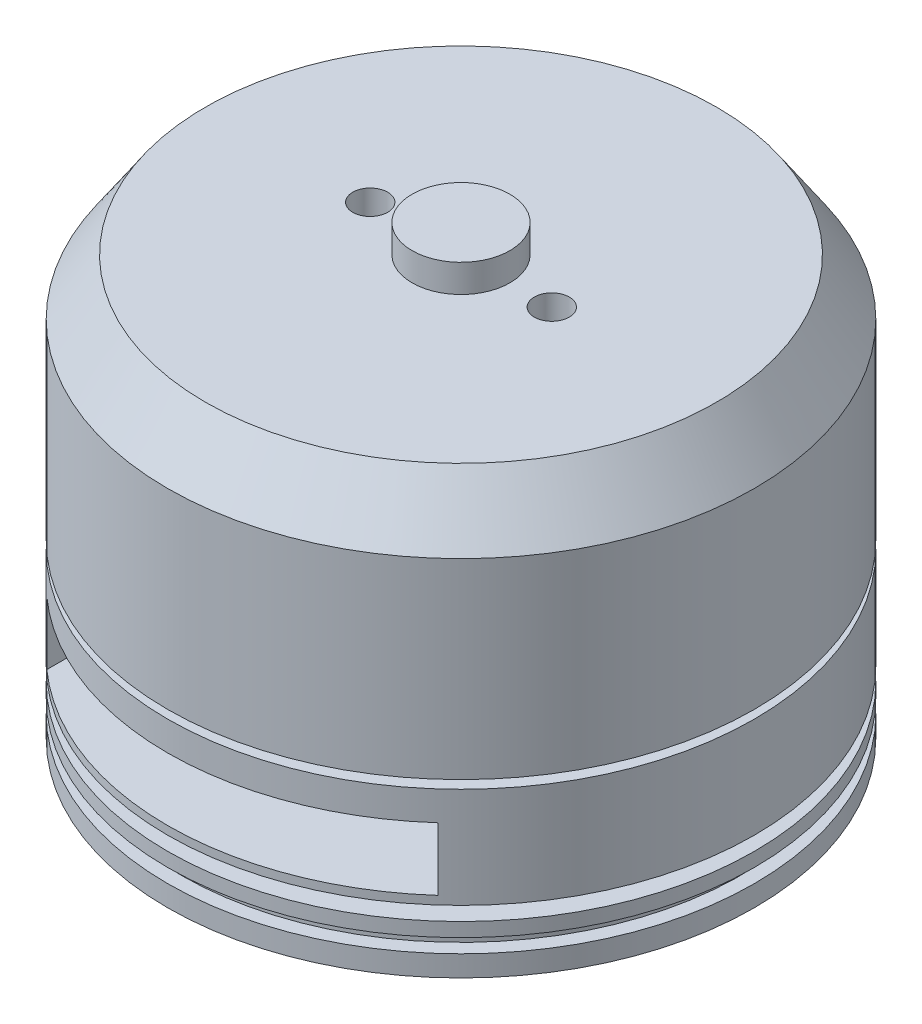
ISO-10303-21;
HEADER;
FILE_DESCRIPTION(('STEP AP214'),'2;1');
FILE_NAME('part.step','',(''),(''),'','','');
FILE_SCHEMA(('AUTOMOTIVE_DESIGN { 1 0 10303 214 1 1 1 1 }'));
ENDSEC;
DATA;
#1=APPLICATION_CONTEXT('core data for automotive mechanical design processes');
#2=APPLICATION_PROTOCOL_DEFINITION('international standard','automotive_design',2000,#1);
#3=PRODUCT_CONTEXT('',#1,'mechanical');
#4=PRODUCT('Part','Part','',(#3));
#5=PRODUCT_RELATED_PRODUCT_CATEGORY('part','',(#4));
#6=PRODUCT_DEFINITION_FORMATION('','',#4);
#7=PRODUCT_DEFINITION_CONTEXT('part definition',#1,'design');
#8=PRODUCT_DEFINITION('design','',#6,#7);
#9=PRODUCT_DEFINITION_SHAPE('','',#8);
#10=(LENGTH_UNIT() NAMED_UNIT(*) SI_UNIT(.MILLI.,.METRE.));
#11=(NAMED_UNIT(*) PLANE_ANGLE_UNIT() SI_UNIT($,.RADIAN.));
#12=(NAMED_UNIT(*) SI_UNIT($,.STERADIAN.) SOLID_ANGLE_UNIT());
#13=UNCERTAINTY_MEASURE_WITH_UNIT(LENGTH_MEASURE(1.E-05),#10,'distance_accuracy_value','');
#14=(GEOMETRIC_REPRESENTATION_CONTEXT(3) GLOBAL_UNCERTAINTY_ASSIGNED_CONTEXT((#13)) GLOBAL_UNIT_ASSIGNED_CONTEXT((#10,
#11,#12)) REPRESENTATION_CONTEXT('',''));
#15=CARTESIAN_POINT('',(0.,0.,0.));
#16=DIRECTION('',(0.,0.,1.));
#17=DIRECTION('',(1.,0.,0.));
#18=AXIS2_PLACEMENT_3D('',#15,#16,#17);
#19=CARTESIAN_POINT('',(0.,43.7,0.));
#20=DIRECTION('',(0.,1.,0.));
#21=DIRECTION('',(0.,0.,1.));
#22=AXIS2_PLACEMENT_3D('',#19,#20,#21);
#23=CYLINDRICAL_SURFACE('',#22,3.5);
#24=CARTESIAN_POINT('',(0.,38.7,0.));
#25=DIRECTION('',(0.,1.,0.));
#26=DIRECTION('',(0.,0.,1.));
#27=AXIS2_PLACEMENT_3D('',#24,#25,#26);
#28=CIRCLE('',#27,3.5);
#29=CARTESIAN_POINT('',(0.,38.7,3.5));
#30=VERTEX_POINT('',#29);
#31=EDGE_CURVE('E119',#30,#30,#28,.T.);
#32=ORIENTED_EDGE('',*,*,#31,.T.);
#33=EDGE_LOOP('',(#32));
#34=FACE_BOUND('',#33,.T.);
#35=CARTESIAN_POINT('',(0.,40.7,0.));
#36=DIRECTION('',(0.,1.,0.));
#37=DIRECTION('',(0.,0.,1.));
#38=AXIS2_PLACEMENT_3D('',#35,#36,#37);
#39=CIRCLE('',#38,3.5);
#40=CARTESIAN_POINT('',(0.,40.7,3.5));
#41=VERTEX_POINT('',#40);
#42=EDGE_CURVE('E98',#41,#41,#39,.T.);
#43=ORIENTED_EDGE('',*,*,#42,.F.);
#44=EDGE_LOOP('',(#43));
#45=FACE_BOUND('',#44,.T.);
#46=ADVANCED_FACE('F36',(#34,#45),#23,.T.);
#47=CARTESIAN_POINT('',(4.1,6.7,0.));
#48=DIRECTION('',(0.,1.,0.));
#49=DIRECTION('',(0.,0.,1.));
#50=AXIS2_PLACEMENT_3D('',#47,#48,#49);
#51=PLANE('',#50);
#52=CARTESIAN_POINT('',(0.,6.7,0.));
#53=DIRECTION('',(0.,1.,0.));
#54=DIRECTION('',(0.,0.,1.));
#55=AXIS2_PLACEMENT_3D('',#52,#53,#54);
#56=CIRCLE('',#55,13.4);
#57=CARTESIAN_POINT('',(0.,6.7,13.4));
#58=VERTEX_POINT('',#57);
#59=EDGE_CURVE('E176',#58,#58,#56,.T.);
#60=ORIENTED_EDGE('',*,*,#59,.F.);
#61=EDGE_LOOP('',(#60));
#62=FACE_BOUND('',#61,.T.);
#63=ADVANCED_FACE('F38',(#62),#51,.F.);
#64=CARTESIAN_POINT('',(0.,43.7,0.));
#65=DIRECTION('',(0.,1.,0.));
#66=DIRECTION('',(0.,0.,1.));
#67=AXIS2_PLACEMENT_3D('',#64,#65,#66);
#68=CYLINDRICAL_SURFACE('',#67,13.4);
#69=CARTESIAN_POINT('',(0.,8.7,0.));
#70=DIRECTION('',(0.,1.,0.));
#71=DIRECTION('',(0.,0.,1.));
#72=AXIS2_PLACEMENT_3D('',#69,#70,#71);
#73=CIRCLE('',#72,13.4);
#74=CARTESIAN_POINT('',(0.,8.7,13.4));
#75=VERTEX_POINT('',#74);
#76=EDGE_CURVE('E173',#75,#75,#73,.T.);
#77=ORIENTED_EDGE('',*,*,#76,.F.);
#78=EDGE_LOOP('',(#77));
#79=FACE_BOUND('',#78,.T.);
#80=ORIENTED_EDGE('',*,*,#59,.T.);
#81=EDGE_LOOP('',(#80));
#82=FACE_BOUND('',#81,.T.);
#83=ADVANCED_FACE('F211',(#79,#82),#68,.T.);
#84=CARTESIAN_POINT('',(13.4,8.7,0.));
#85=DIRECTION('',(0.,1.,0.));
#86=DIRECTION('',(0.,0.,1.));
#87=AXIS2_PLACEMENT_3D('',#84,#85,#86);
#88=PLANE('',#87);
#89=CARTESIAN_POINT('',(0.,8.7,0.));
#90=DIRECTION('',(0.,1.,0.));
#91=DIRECTION('',(0.,0.,1.));
#92=AXIS2_PLACEMENT_3D('',#89,#90,#91);
#93=CIRCLE('',#92,21.);
#94=CARTESIAN_POINT('',(0.,8.7,21.));
#95=VERTEX_POINT('',#94);
#96=EDGE_CURVE('E170',#95,#95,#93,.T.);
#97=ORIENTED_EDGE('',*,*,#96,.F.);
#98=EDGE_LOOP('',(#97));
#99=FACE_BOUND('',#98,.T.);
#100=ORIENTED_EDGE('',*,*,#76,.T.);
#101=EDGE_LOOP('',(#100));
#102=FACE_BOUND('',#101,.T.);
#103=ADVANCED_FACE('F273',(#99,#102),#88,.F.);
#104=CARTESIAN_POINT('',(0.,43.7,0.));
#105=DIRECTION('',(0.,1.,0.));
#106=DIRECTION('',(0.,0.,1.));
#107=AXIS2_PLACEMENT_3D('',#104,#105,#106);
#108=CYLINDRICAL_SURFACE('',#107,21.);
#109=CARTESIAN_POINT('',(0.,10.2,0.));
#110=DIRECTION('',(0.,1.,0.));
#111=DIRECTION('',(0.,0.,1.));
#112=AXIS2_PLACEMENT_3D('',#109,#110,#111);
#113=CIRCLE('',#112,21.);
#114=CARTESIAN_POINT('',(0.,10.2,21.));
#115=VERTEX_POINT('',#114);
#116=EDGE_CURVE('E167',#115,#115,#113,.T.);
#117=ORIENTED_EDGE('',*,*,#116,.F.);
#118=EDGE_LOOP('',(#117));
#119=FACE_BOUND('',#118,.T.);
#120=ORIENTED_EDGE('',*,*,#96,.T.);
#121=EDGE_LOOP('',(#120));
#122=FACE_BOUND('',#121,.T.);
#123=ADVANCED_FACE('F269',(#119,#122),#108,.T.);
#124=CARTESIAN_POINT('',(21.,10.2,0.));
#125=DIRECTION('',(0.,-1.,0.));
#126=DIRECTION('',(0.,0.,-1.));
#127=AXIS2_PLACEMENT_3D('',#124,#125,#126);
#128=PLANE('',#127);
#129=CARTESIAN_POINT('',(0.,10.2,0.));
#130=DIRECTION('',(0.,1.,0.));
#131=DIRECTION('',(0.,0.,1.));
#132=AXIS2_PLACEMENT_3D('',#129,#130,#131);
#133=CIRCLE('',#132,20.);
#134=CARTESIAN_POINT('',(0.,10.2,20.));
#135=VERTEX_POINT('',#134);
#136=EDGE_CURVE('E164',#135,#135,#133,.T.);
#137=ORIENTED_EDGE('',*,*,#136,.F.);
#138=EDGE_LOOP('',(#137));
#139=FACE_BOUND('',#138,.T.);
#140=ORIENTED_EDGE('',*,*,#116,.T.);
#141=EDGE_LOOP('',(#140));
#142=FACE_BOUND('',#141,.T.);
#143=ADVANCED_FACE('F265',(#139,#142),#128,.F.);
#144=CARTESIAN_POINT('',(0.,43.7,0.));
#145=DIRECTION('',(0.,1.,0.));
#146=DIRECTION('',(0.,0.,1.));
#147=AXIS2_PLACEMENT_3D('',#144,#145,#146);
#148=CYLINDRICAL_SURFACE('',#147,20.);
#149=CARTESIAN_POINT('',(0.,11.2,0.));
#150=DIRECTION('',(0.,1.,0.));
#151=DIRECTION('',(0.,0.,1.));
#152=AXIS2_PLACEMENT_3D('',#149,#150,#151);
#153=CIRCLE('',#152,20.);
#154=CARTESIAN_POINT('',(0.,11.2,20.));
#155=VERTEX_POINT('',#154);
#156=EDGE_CURVE('E161',#155,#155,#153,.T.);
#157=ORIENTED_EDGE('',*,*,#156,.F.);
#158=EDGE_LOOP('',(#157));
#159=FACE_BOUND('',#158,.T.);
#160=ORIENTED_EDGE('',*,*,#136,.T.);
#161=EDGE_LOOP('',(#160));
#162=FACE_BOUND('',#161,.T.);
#163=ADVANCED_FACE('F261',(#159,#162),#148,.T.);
#164=CARTESIAN_POINT('',(20.,11.2,0.));
#165=DIRECTION('',(0.,1.,0.));
#166=DIRECTION('',(0.,0.,1.));
#167=AXIS2_PLACEMENT_3D('',#164,#165,#166);
#168=PLANE('',#167);
#169=CARTESIAN_POINT('',(0.,11.2,0.));
#170=DIRECTION('',(0.,1.,0.));
#171=DIRECTION('',(0.,0.,1.));
#172=AXIS2_PLACEMENT_3D('',#169,#170,#171);
#173=CIRCLE('',#172,21.);
#174=CARTESIAN_POINT('',(0.,11.2,21.));
#175=VERTEX_POINT('',#174);
#176=EDGE_CURVE('E158',#175,#175,#173,.T.);
#177=ORIENTED_EDGE('',*,*,#176,.F.);
#178=EDGE_LOOP('',(#177));
#179=FACE_BOUND('',#178,.T.);
#180=ORIENTED_EDGE('',*,*,#156,.T.);
#181=EDGE_LOOP('',(#180));
#182=FACE_BOUND('',#181,.T.);
#183=ADVANCED_FACE('F257',(#179,#182),#168,.F.);
#184=CARTESIAN_POINT('',(0.,43.7,0.));
#185=DIRECTION('',(0.,1.,0.));
#186=DIRECTION('',(0.,0.,1.));
#187=AXIS2_PLACEMENT_3D('',#184,#185,#186);
#188=CYLINDRICAL_SURFACE('',#187,21.);
#189=CARTESIAN_POINT('',(0.,12.2,0.));
#190=DIRECTION('',(0.,1.,0.));
#191=DIRECTION('',(0.,0.,1.));
#192=AXIS2_PLACEMENT_3D('',#189,#190,#191);
#193=CIRCLE('',#192,21.);
#194=CARTESIAN_POINT('',(0.,12.2,21.));
#195=VERTEX_POINT('',#194);
#196=EDGE_CURVE('E155',#195,#195,#193,.T.);
#197=ORIENTED_EDGE('',*,*,#196,.F.);
#198=EDGE_LOOP('',(#197));
#199=FACE_BOUND('',#198,.T.);
#200=ORIENTED_EDGE('',*,*,#176,.T.);
#201=EDGE_LOOP('',(#200));
#202=FACE_BOUND('',#201,.T.);
#203=ADVANCED_FACE('F253',(#199,#202),#188,.T.);
#204=CARTESIAN_POINT('',(21.,12.2,0.));
#205=DIRECTION('',(0.,-1.,0.));
#206=DIRECTION('',(0.,0.,-1.));
#207=AXIS2_PLACEMENT_3D('',#204,#205,#206);
#208=PLANE('',#207);
#209=CARTESIAN_POINT('',(0.,12.2,0.));
#210=DIRECTION('',(0.,1.,0.));
#211=DIRECTION('',(0.,0.,1.));
#212=AXIS2_PLACEMENT_3D('',#209,#210,#211);
#213=CIRCLE('',#212,10.);
#214=CARTESIAN_POINT('',(0.,12.2,10.));
#215=VERTEX_POINT('',#214);
#216=EDGE_CURVE('E152',#215,#215,#213,.T.);
#217=ORIENTED_EDGE('',*,*,#216,.F.);
#218=EDGE_LOOP('',(#217));
#219=FACE_BOUND('',#218,.T.);
#220=ORIENTED_EDGE('',*,*,#196,.T.);
#221=EDGE_LOOP('',(#220));
#222=FACE_BOUND('',#221,.T.);
#223=ADVANCED_FACE('F249',(#219,#222),#208,.F.);
#224=CARTESIAN_POINT('',(0.,43.7,0.));
#225=DIRECTION('',(0.,1.,0.));
#226=DIRECTION('',(0.,0.,1.));
#227=AXIS2_PLACEMENT_3D('',#224,#225,#226);
#228=CYLINDRICAL_SURFACE('',#227,10.);
#229=CARTESIAN_POINT('',(0.,13.2,0.));
#230=DIRECTION('',(0.,1.,0.));
#231=DIRECTION('',(0.,0.,1.));
#232=AXIS2_PLACEMENT_3D('',#229,#230,#231);
#233=CIRCLE('',#232,10.);
#234=CARTESIAN_POINT('',(0.,13.2,10.));
#235=VERTEX_POINT('',#234);
#236=EDGE_CURVE('E149',#235,#235,#233,.T.);
#237=ORIENTED_EDGE('',*,*,#236,.F.);
#238=EDGE_LOOP('',(#237));
#239=FACE_BOUND('',#238,.T.);
#240=ORIENTED_EDGE('',*,*,#216,.T.);
#241=EDGE_LOOP('',(#240));
#242=FACE_BOUND('',#241,.T.);
#243=ADVANCED_FACE('F245',(#239,#242),#228,.T.);
#244=CARTESIAN_POINT('',(10.,13.2,0.));
#245=DIRECTION('',(0.,1.,0.));
#246=DIRECTION('',(0.,0.,1.));
#247=AXIS2_PLACEMENT_3D('',#244,#245,#246);
#248=PLANE('',#247);
#249=CARTESIAN_POINT('',(0.,13.2,0.));
#250=DIRECTION('',(0.,1.,0.));
#251=DIRECTION('',(0.,0.,1.));
#252=AXIS2_PLACEMENT_3D('',#249,#250,#251);
#253=CIRCLE('',#252,21.);
#254=CARTESIAN_POINT('',(0.,13.2,21.));
#255=VERTEX_POINT('',#254);
#256=EDGE_CURVE('E146',#255,#255,#253,.T.);
#257=ORIENTED_EDGE('',*,*,#256,.F.);
#258=EDGE_LOOP('',(#257));
#259=FACE_BOUND('',#258,.T.);
#260=ORIENTED_EDGE('',*,*,#236,.T.);
#261=EDGE_LOOP('',(#260));
#262=FACE_BOUND('',#261,.T.);
#263=ADVANCED_FACE('F242',(#259,#262),#248,.F.);
#264=CARTESIAN_POINT('',(0.,43.7,0.));
#265=DIRECTION('',(0.,1.,0.));
#266=DIRECTION('',(0.,0.,1.));
#267=AXIS2_PLACEMENT_3D('',#264,#265,#266);
#268=CYLINDRICAL_SURFACE('',#267,21.);
#269=CARTESIAN_POINT('',(0.,18.3,0.));
#270=DIRECTION('',(0.,1.,0.));
#271=DIRECTION('',(0.,0.,1.));
#272=AXIS2_PLACEMENT_3D('',#269,#270,#271);
#273=CIRCLE('',#272,21.);
#274=CARTESIAN_POINT('',(-14.,18.3,15.6524758424985));
#275=VERTEX_POINT('',#274);
#276=CARTESIAN_POINT('',(14.,18.3,15.6524758424985));
#277=VERTEX_POINT('',#276);
#278=EDGE_CURVE('E179',#275,#277,#273,.T.);
#279=ORIENTED_EDGE('',*,*,#278,.T.);
#280=DIRECTION('',(0.,1.,0.));
#281=VECTOR('',#280,1.);
#282=CARTESIAN_POINT('',(14.,43.7,15.6524758424985));
#283=LINE('',#282,#281);
#284=CARTESIAN_POINT('',(14.,13.8,15.6524758424985));
#285=VERTEX_POINT('',#284);
#286=EDGE_CURVE('E11',#277,#285,#283,.F.);
#287=ORIENTED_EDGE('',*,*,#286,.T.);
#288=CARTESIAN_POINT('',(0.,13.8,0.));
#289=DIRECTION('',(0.,-1.,0.));
#290=DIRECTION('',(0.,0.,-1.));
#291=AXIS2_PLACEMENT_3D('',#288,#289,#290);
#292=CIRCLE('',#291,21.);
#293=CARTESIAN_POINT('',(-14.,13.8,15.6524758424985));
#294=VERTEX_POINT('',#293);
#295=EDGE_CURVE('E44',#285,#294,#292,.T.);
#296=ORIENTED_EDGE('',*,*,#295,.T.);
#297=DIRECTION('',(0.,1.,0.));
#298=VECTOR('',#297,1.);
#299=CARTESIAN_POINT('',(-14.,43.7,15.6524758424985));
#300=LINE('',#299,#298);
#301=EDGE_CURVE('E58',#294,#275,#300,.T.);
#302=ORIENTED_EDGE('',*,*,#301,.T.);
#303=EDGE_LOOP('',(#279,#287,#296,#302));
#304=FACE_BOUND('',#303,.T.);
#305=CARTESIAN_POINT('',(0.,20.4,0.));
#306=DIRECTION('',(0.,1.,0.));
#307=DIRECTION('',(0.,0.,1.));
#308=AXIS2_PLACEMENT_3D('',#305,#306,#307);
#309=CIRCLE('',#308,21.);
#310=CARTESIAN_POINT('',(0.,20.4,21.));
#311=VERTEX_POINT('',#310);
#312=EDGE_CURVE('E143',#311,#311,#309,.T.);
#313=ORIENTED_EDGE('',*,*,#312,.F.);
#314=EDGE_LOOP('',(#313));
#315=FACE_BOUND('',#314,.T.);
#316=ORIENTED_EDGE('',*,*,#256,.T.);
#317=EDGE_LOOP('',(#316));
#318=FACE_BOUND('',#317,.T.);
#319=ADVANCED_FACE('F182',(#304,#315,#318),#268,.T.);
#320=CARTESIAN_POINT('',(21.,20.4,0.));
#321=DIRECTION('',(0.,-1.,0.));
#322=DIRECTION('',(0.,0.,-1.));
#323=AXIS2_PLACEMENT_3D('',#320,#321,#322);
#324=PLANE('',#323);
#325=CARTESIAN_POINT('',(0.,20.4,0.));
#326=DIRECTION('',(0.,1.,0.));
#327=DIRECTION('',(0.,0.,1.));
#328=AXIS2_PLACEMENT_3D('',#325,#326,#327);
#329=CIRCLE('',#328,5.);
#330=CARTESIAN_POINT('',(0.,20.4,5.));
#331=VERTEX_POINT('',#330);
#332=EDGE_CURVE('E140',#331,#331,#329,.T.);
#333=ORIENTED_EDGE('',*,*,#332,.F.);
#334=EDGE_LOOP('',(#333));
#335=FACE_BOUND('',#334,.T.);
#336=ORIENTED_EDGE('',*,*,#312,.T.);
#337=EDGE_LOOP('',(#336));
#338=FACE_BOUND('',#337,.T.);
#339=ADVANCED_FACE('F235',(#335,#338),#324,.F.);
#340=CARTESIAN_POINT('',(0.,43.7,0.));
#341=DIRECTION('',(0.,1.,0.));
#342=DIRECTION('',(0.,0.,1.));
#343=AXIS2_PLACEMENT_3D('',#340,#341,#342);
#344=CYLINDRICAL_SURFACE('',#343,5.);
#345=CARTESIAN_POINT('',(0.,21.,0.));
#346=DIRECTION('',(0.,1.,0.));
#347=DIRECTION('',(0.,0.,1.));
#348=AXIS2_PLACEMENT_3D('',#345,#346,#347);
#349=CIRCLE('',#348,5.);
#350=CARTESIAN_POINT('',(0.,21.,5.));
#351=VERTEX_POINT('',#350);
#352=EDGE_CURVE('E137',#351,#351,#349,.T.);
#353=ORIENTED_EDGE('',*,*,#352,.F.);
#354=EDGE_LOOP('',(#353));
#355=FACE_BOUND('',#354,.T.);
#356=ORIENTED_EDGE('',*,*,#332,.T.);
#357=EDGE_LOOP('',(#356));
#358=FACE_BOUND('',#357,.T.);
#359=ADVANCED_FACE('F231',(#355,#358),#344,.T.);
#360=CARTESIAN_POINT('',(5.,21.,0.));
#361=DIRECTION('',(0.,1.,0.));
#362=DIRECTION('',(0.,0.,1.));
#363=AXIS2_PLACEMENT_3D('',#360,#361,#362);
#364=PLANE('',#363);
#365=CARTESIAN_POINT('',(0.,21.,0.));
#366=DIRECTION('',(0.,1.,0.));
#367=DIRECTION('',(0.,0.,1.));
#368=AXIS2_PLACEMENT_3D('',#365,#366,#367);
#369=CIRCLE('',#368,21.);
#370=CARTESIAN_POINT('',(0.,21.,21.));
#371=VERTEX_POINT('',#370);
#372=EDGE_CURVE('E134',#371,#371,#369,.T.);
#373=ORIENTED_EDGE('',*,*,#372,.F.);
#374=EDGE_LOOP('',(#373));
#375=FACE_BOUND('',#374,.T.);
#376=ORIENTED_EDGE('',*,*,#352,.T.);
#377=EDGE_LOOP('',(#376));
#378=FACE_BOUND('',#377,.T.);
#379=ADVANCED_FACE('F227',(#375,#378),#364,.F.);
#380=CARTESIAN_POINT('',(0.,43.7,0.));
#381=DIRECTION('',(0.,1.,0.));
#382=DIRECTION('',(0.,0.,1.));
#383=AXIS2_PLACEMENT_3D('',#380,#381,#382);
#384=CYLINDRICAL_SURFACE('',#383,21.);
#385=CARTESIAN_POINT('',(0.,34.7,0.));
#386=DIRECTION('',(0.,1.,0.));
#387=DIRECTION('',(0.,0.,1.));
#388=AXIS2_PLACEMENT_3D('',#385,#386,#387);
#389=CIRCLE('',#388,21.);
#390=CARTESIAN_POINT('',(0.,34.7,21.));
#391=VERTEX_POINT('',#390);
#392=EDGE_CURVE('E131',#391,#391,#389,.T.);
#393=ORIENTED_EDGE('',*,*,#392,.F.);
#394=EDGE_LOOP('',(#393));
#395=FACE_BOUND('',#394,.T.);
#396=ORIENTED_EDGE('',*,*,#372,.T.);
#397=EDGE_LOOP('',(#396));
#398=FACE_BOUND('',#397,.T.);
#399=ADVANCED_FACE('F223',(#395,#398),#384,.T.);
#400=CARTESIAN_POINT('',(0.,34.7,0.));
#401=DIRECTION('',(0.,-1.,0.));
#402=DIRECTION('',(0.,0.,-1.));
#403=AXIS2_PLACEMENT_3D('',#400,#401,#402);
#404=CONICAL_SURFACE('',#403,21.,0.593749666710772);
#405=CARTESIAN_POINT('',(0.,38.7,0.));
#406=DIRECTION('',(0.,1.,0.));
#407=DIRECTION('',(0.,0.,1.));
#408=AXIS2_PLACEMENT_3D('',#405,#406,#407);
#409=CIRCLE('',#408,18.3);
#410=CARTESIAN_POINT('',(0.,38.7,18.3));
#411=VERTEX_POINT('',#410);
#412=EDGE_CURVE('E128',#411,#411,#409,.T.);
#413=ORIENTED_EDGE('',*,*,#412,.F.);
#414=EDGE_LOOP('',(#413));
#415=FACE_BOUND('',#414,.T.);
#416=ORIENTED_EDGE('',*,*,#392,.T.);
#417=EDGE_LOOP('',(#416));
#418=FACE_BOUND('',#417,.T.);
#419=ADVANCED_FACE('F219',(#415,#418),#404,.T.);
#420=CARTESIAN_POINT('',(18.3,38.7,0.));
#421=DIRECTION('',(0.,-1.,0.));
#422=DIRECTION('',(0.,0.,-1.));
#423=AXIS2_PLACEMENT_3D('',#420,#421,#422);
#424=PLANE('',#423);
#425=CARTESIAN_POINT('',(-6.5,38.7,0.));
#426=DIRECTION('',(0.,1.,0.));
#427=DIRECTION('',(0.,0.,1.));
#428=AXIS2_PLACEMENT_3D('',#425,#426,#427);
#429=CIRCLE('',#428,1.24999999999999);
#430=CARTESIAN_POINT('',(-6.5,38.7,1.24999999999999));
#431=VERTEX_POINT('',#430);
#432=EDGE_CURVE('E92',#431,#431,#429,.T.);
#433=ORIENTED_EDGE('',*,*,#432,.F.);
#434=EDGE_LOOP('',(#433));
#435=FACE_BOUND('',#434,.T.);
#436=CARTESIAN_POINT('',(6.5,38.7,0.));
#437=DIRECTION('',(0.,1.,0.));
#438=DIRECTION('',(0.,0.,1.));
#439=AXIS2_PLACEMENT_3D('',#436,#437,#438);
#440=CIRCLE('',#439,1.24999999999999);
#441=CARTESIAN_POINT('',(6.5,38.7,1.24999999999999));
#442=VERTEX_POINT('',#441);
#443=EDGE_CURVE('E91',#442,#442,#440,.T.);
#444=ORIENTED_EDGE('',*,*,#443,.F.);
#445=EDGE_LOOP('',(#444));
#446=FACE_BOUND('',#445,.T.);
#447=ORIENTED_EDGE('',*,*,#31,.F.);
#448=EDGE_LOOP('',(#447));
#449=FACE_BOUND('',#448,.T.);
#450=ORIENTED_EDGE('',*,*,#412,.T.);
#451=EDGE_LOOP('',(#450));
#452=FACE_BOUND('',#451,.T.);
#453=ADVANCED_FACE('F216',(#435,#446,#449,#452),#424,.F.);
#454=CARTESIAN_POINT('',(14.,18.3,11.));
#455=DIRECTION('',(1.,0.,0.));
#456=DIRECTION('',(0.,0.,-1.));
#457=AXIS2_PLACEMENT_3D('',#454,#455,#456);
#458=PLANE('',#457);
#459=DIRECTION('',(0.,0.,1.));
#460=VECTOR('',#459,1.);
#461=CARTESIAN_POINT('',(14.,18.3,11.));
#462=LINE('',#461,#460);
#463=CARTESIAN_POINT('',(14.,18.3,11.));
#464=VERTEX_POINT('',#463);
#465=EDGE_CURVE('E116',#464,#277,#462,.T.);
#466=ORIENTED_EDGE('',*,*,#465,.F.);
#467=DIRECTION('',(0.,1.,0.));
#468=VECTOR('',#467,1.);
#469=CARTESIAN_POINT('',(14.,18.3,11.));
#470=LINE('',#469,#468);
#471=CARTESIAN_POINT('',(14.,13.8,11.));
#472=VERTEX_POINT('',#471);
#473=EDGE_CURVE('E104',#472,#464,#470,.T.);
#474=ORIENTED_EDGE('',*,*,#473,.F.);
#475=DIRECTION('',(0.,0.,1.));
#476=VECTOR('',#475,1.);
#477=CARTESIAN_POINT('',(14.,13.8,11.));
#478=LINE('',#477,#476);
#479=EDGE_CURVE('E117',#472,#285,#478,.T.);
#480=ORIENTED_EDGE('',*,*,#479,.T.);
#481=ORIENTED_EDGE('',*,*,#286,.F.);
#482=EDGE_LOOP('',(#466,#474,#480,#481));
#483=FACE_BOUND('',#482,.T.);
#484=ADVANCED_FACE('F186',(#483),#458,.F.);
#485=CARTESIAN_POINT('',(-14.,13.8,11.));
#486=DIRECTION('',(0.,-1.,0.));
#487=DIRECTION('',(0.,0.,-1.));
#488=AXIS2_PLACEMENT_3D('',#485,#486,#487);
#489=PLANE('',#488);
#490=ORIENTED_EDGE('',*,*,#479,.F.);
#491=DIRECTION('',(1.,0.,0.));
#492=VECTOR('',#491,1.);
#493=CARTESIAN_POINT('',(-14.,13.8,11.));
#494=LINE('',#493,#492);
#495=CARTESIAN_POINT('',(-14.,13.8,11.));
#496=VERTEX_POINT('',#495);
#497=EDGE_CURVE('E113',#496,#472,#494,.T.);
#498=ORIENTED_EDGE('',*,*,#497,.F.);
#499=DIRECTION('',(0.,0.,1.));
#500=VECTOR('',#499,1.);
#501=CARTESIAN_POINT('',(-14.,13.8,11.));
#502=LINE('',#501,#500);
#503=EDGE_CURVE('E120',#496,#294,#502,.T.);
#504=ORIENTED_EDGE('',*,*,#503,.T.);
#505=ORIENTED_EDGE('',*,*,#295,.F.);
#506=EDGE_LOOP('',(#490,#498,#504,#505));
#507=FACE_BOUND('',#506,.T.);
#508=ADVANCED_FACE('F195',(#507),#489,.F.);
#509=CARTESIAN_POINT('',(-14.,18.3,11.));
#510=DIRECTION('',(-1.,0.,0.));
#511=DIRECTION('',(0.,-1.,0.));
#512=AXIS2_PLACEMENT_3D('',#509,#510,#511);
#513=PLANE('',#512);
#514=ORIENTED_EDGE('',*,*,#503,.F.);
#515=DIRECTION('',(0.,-1.,0.));
#516=VECTOR('',#515,1.);
#517=CARTESIAN_POINT('',(-14.,18.3,11.));
#518=LINE('',#517,#516);
#519=CARTESIAN_POINT('',(-14.,18.3,11.));
#520=VERTEX_POINT('',#519);
#521=EDGE_CURVE('E110',#520,#496,#518,.T.);
#522=ORIENTED_EDGE('',*,*,#521,.F.);
#523=DIRECTION('',(0.,0.,1.));
#524=VECTOR('',#523,1.);
#525=CARTESIAN_POINT('',(-14.,18.3,11.));
#526=LINE('',#525,#524);
#527=EDGE_CURVE('E122',#520,#275,#526,.T.);
#528=ORIENTED_EDGE('',*,*,#527,.T.);
#529=ORIENTED_EDGE('',*,*,#301,.F.);
#530=EDGE_LOOP('',(#514,#522,#528,#529));
#531=FACE_BOUND('',#530,.T.);
#532=ADVANCED_FACE('F196',(#531),#513,.F.);
#533=CARTESIAN_POINT('',(-14.,18.3,11.));
#534=DIRECTION('',(0.,1.,0.));
#535=DIRECTION('',(0.,0.,1.));
#536=AXIS2_PLACEMENT_3D('',#533,#534,#535);
#537=PLANE('',#536);
#538=ORIENTED_EDGE('',*,*,#278,.F.);
#539=ORIENTED_EDGE('',*,*,#527,.F.);
#540=DIRECTION('',(-1.,0.,0.));
#541=VECTOR('',#540,1.);
#542=CARTESIAN_POINT('',(-14.,18.3,11.));
#543=LINE('',#542,#541);
#544=EDGE_CURVE('E107',#464,#520,#543,.T.);
#545=ORIENTED_EDGE('',*,*,#544,.F.);
#546=ORIENTED_EDGE('',*,*,#465,.T.);
#547=EDGE_LOOP('',(#538,#539,#545,#546));
#548=FACE_BOUND('',#547,.T.);
#549=ADVANCED_FACE('F190',(#548),#537,.F.);
#550=CARTESIAN_POINT('',(0.,0.,11.));
#551=DIRECTION('',(0.,0.,1.));
#552=DIRECTION('',(1.,0.,0.));
#553=AXIS2_PLACEMENT_3D('',#550,#551,#552);
#554=PLANE('',#553);
#555=ORIENTED_EDGE('',*,*,#473,.T.);
#556=ORIENTED_EDGE('',*,*,#544,.T.);
#557=ORIENTED_EDGE('',*,*,#521,.T.);
#558=ORIENTED_EDGE('',*,*,#497,.T.);
#559=EDGE_LOOP('',(#555,#556,#557,#558));
#560=FACE_BOUND('',#559,.T.);
#561=ADVANCED_FACE('F193',(#560),#554,.T.);
#562=CARTESIAN_POINT('',(6.5,34.7,0.));
#563=DIRECTION('',(0.,1.,0.));
#564=DIRECTION('',(0.,0.,1.));
#565=AXIS2_PLACEMENT_3D('',#562,#563,#564);
#566=CONICAL_SURFACE('',#565,1.25,1.02974425867665);
#567=CARTESIAN_POINT('',(6.5,33.9489242262155,0.));
#568=VERTEX_POINT('',#567);
#569=VERTEX_LOOP('',#568);
#570=FACE_BOUND('',#569,.T.);
#571=CARTESIAN_POINT('',(6.5,34.7,0.));
#572=DIRECTION('',(0.,1.,0.));
#573=DIRECTION('',(0.,0.,1.));
#574=AXIS2_PLACEMENT_3D('',#571,#572,#573);
#575=CIRCLE('',#574,1.25);
#576=CARTESIAN_POINT('',(6.5,34.7,1.25));
#577=VERTEX_POINT('',#576);
#578=EDGE_CURVE('E95',#577,#577,#575,.T.);
#579=ORIENTED_EDGE('',*,*,#578,.T.);
#580=EDGE_LOOP('',(#579));
#581=FACE_BOUND('',#580,.T.);
#582=ADVANCED_FACE('F379',(#570,#581),#566,.F.);
#583=CARTESIAN_POINT('',(6.5,38.7,0.));
#584=DIRECTION('',(0.,1.,0.));
#585=DIRECTION('',(0.,0.,1.));
#586=AXIS2_PLACEMENT_3D('',#583,#584,#585);
#587=CYLINDRICAL_SURFACE('',#586,1.24999999999999);
#588=ORIENTED_EDGE('',*,*,#578,.F.);
#589=EDGE_LOOP('',(#588));
#590=FACE_BOUND('',#589,.T.);
#591=ORIENTED_EDGE('',*,*,#443,.T.);
#592=EDGE_LOOP('',(#591));
#593=FACE_BOUND('',#592,.T.);
#594=ADVANCED_FACE('F85',(#590,#593),#587,.F.);
#595=CARTESIAN_POINT('',(-6.5,34.7,0.));
#596=DIRECTION('',(0.,1.,0.));
#597=DIRECTION('',(0.,0.,1.));
#598=AXIS2_PLACEMENT_3D('',#595,#596,#597);
#599=CONICAL_SURFACE('',#598,1.25,1.02974425867665);
#600=CARTESIAN_POINT('',(-6.5,33.9489242262155,0.));
#601=VERTEX_POINT('',#600);
#602=VERTEX_LOOP('',#601);
#603=FACE_BOUND('',#602,.T.);
#604=CARTESIAN_POINT('',(-6.5,34.7,0.));
#605=DIRECTION('',(0.,1.,0.));
#606=DIRECTION('',(0.,0.,1.));
#607=AXIS2_PLACEMENT_3D('',#604,#605,#606);
#608=CIRCLE('',#607,1.25);
#609=CARTESIAN_POINT('',(-6.5,34.7,1.25));
#610=VERTEX_POINT('',#609);
#611=EDGE_CURVE('E89',#610,#610,#608,.T.);
#612=ORIENTED_EDGE('',*,*,#611,.T.);
#613=EDGE_LOOP('',(#612));
#614=FACE_BOUND('',#613,.T.);
#615=ADVANCED_FACE('F81',(#603,#614),#599,.F.);
#616=CARTESIAN_POINT('',(-6.5,38.7,0.));
#617=DIRECTION('',(0.,1.,0.));
#618=DIRECTION('',(0.,0.,1.));
#619=AXIS2_PLACEMENT_3D('',#616,#617,#618);
#620=CYLINDRICAL_SURFACE('',#619,1.24999999999999);
#621=ORIENTED_EDGE('',*,*,#611,.F.);
#622=EDGE_LOOP('',(#621));
#623=FACE_BOUND('',#622,.T.);
#624=ORIENTED_EDGE('',*,*,#432,.T.);
#625=EDGE_LOOP('',(#624));
#626=FACE_BOUND('',#625,.T.);
#627=ADVANCED_FACE('F84',(#623,#626),#620,.F.);
#628=CARTESIAN_POINT('',(0.,40.7,0.));
#629=DIRECTION('',(0.,1.,0.));
#630=DIRECTION('',(0.,0.,1.));
#631=AXIS2_PLACEMENT_3D('',#628,#629,#630);
#632=PLANE('',#631);
#633=ORIENTED_EDGE('',*,*,#42,.T.);
#634=EDGE_LOOP('',(#633));
#635=FACE_BOUND('',#634,.T.);
#636=ADVANCED_FACE('F407',(#635),#632,.T.);
#637=CLOSED_SHELL('',(#46,#63,#83,#103,#123,#143,#163,#183,#203,#223,#243,#263,#319,#339,#359,
#379,#399,#419,#453,#484,#508,#532,#549,#561,#582,#594,#615,#627,#636));
#638=MANIFOLD_SOLID_BREP('B2',#637);
#639=ADVANCED_BREP_SHAPE_REPRESENTATION('',(#18,#638),#14);
#640=SHAPE_DEFINITION_REPRESENTATION(#9,#639);
ENDSEC;
END-ISO-10303-21;
